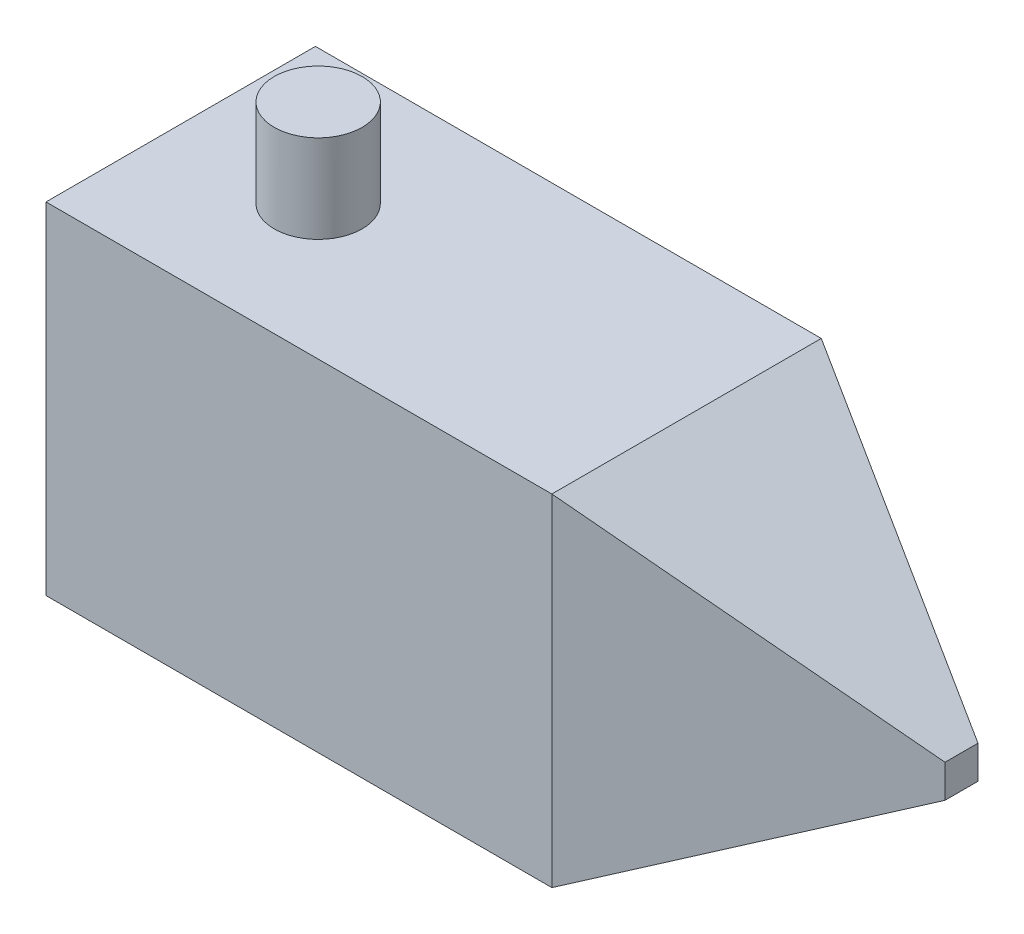
ISO-10303-21;
HEADER;
FILE_DESCRIPTION(('STEP AP214'),'2;1');
FILE_NAME('part.step','',(''),(''),'','','');
FILE_SCHEMA(('AUTOMOTIVE_DESIGN { 1 0 10303 214 1 1 1 1 }'));
ENDSEC;
DATA;
#1=APPLICATION_CONTEXT('core data for automotive mechanical design processes');
#2=APPLICATION_PROTOCOL_DEFINITION('international standard','automotive_design',2000,#1);
#3=PRODUCT_CONTEXT('',#1,'mechanical');
#4=PRODUCT('Part','Part','',(#3));
#5=PRODUCT_RELATED_PRODUCT_CATEGORY('part','',(#4));
#6=PRODUCT_DEFINITION_FORMATION('','',#4);
#7=PRODUCT_DEFINITION_CONTEXT('part definition',#1,'design');
#8=PRODUCT_DEFINITION('design','',#6,#7);
#9=PRODUCT_DEFINITION_SHAPE('','',#8);
#10=(LENGTH_UNIT() NAMED_UNIT(*) SI_UNIT(.MILLI.,.METRE.));
#11=(NAMED_UNIT(*) PLANE_ANGLE_UNIT() SI_UNIT($,.RADIAN.));
#12=(NAMED_UNIT(*) SI_UNIT($,.STERADIAN.) SOLID_ANGLE_UNIT());
#13=UNCERTAINTY_MEASURE_WITH_UNIT(LENGTH_MEASURE(1.E-05),#10,'distance_accuracy_value','');
#14=(GEOMETRIC_REPRESENTATION_CONTEXT(3) GLOBAL_UNCERTAINTY_ASSIGNED_CONTEXT((#13)) GLOBAL_UNIT_ASSIGNED_CONTEXT((#10,
#11,#12)) REPRESENTATION_CONTEXT('',''));
#15=CARTESIAN_POINT('',(0.,0.,0.));
#16=DIRECTION('',(0.,0.,1.));
#17=DIRECTION('',(1.,0.,0.));
#18=AXIS2_PLACEMENT_3D('',#15,#16,#17);
#19=CARTESIAN_POINT('',(0.,0.,0.));
#20=DIRECTION('',(0.,-1.,0.));
#21=DIRECTION('',(0.,0.,-1.));
#22=AXIS2_PLACEMENT_3D('',#19,#20,#21);
#23=PLANE('',#22);
#24=DIRECTION('',(0.,0.,1.));
#25=VECTOR('',#24,1.);
#26=CARTESIAN_POINT('',(23.,0.,0.));
#27=LINE('',#26,#25);
#28=CARTESIAN_POINT('',(23.,0.,12.25));
#29=VERTEX_POINT('',#28);
#30=CARTESIAN_POINT('',(23.,0.,-12.25));
#31=VERTEX_POINT('',#30);
#32=EDGE_CURVE('E373',#29,#31,#27,.F.);
#33=ORIENTED_EDGE('',*,*,#32,.F.);
#34=DIRECTION('',(1.,0.,0.));
#35=VECTOR('',#34,1.);
#36=CARTESIAN_POINT('',(-23.,0.,12.25));
#37=LINE('',#36,#35);
#38=CARTESIAN_POINT('',(-23.,0.,12.25));
#39=VERTEX_POINT('',#38);
#40=EDGE_CURVE('E382',#39,#29,#37,.T.);
#41=ORIENTED_EDGE('',*,*,#40,.F.);
#42=DIRECTION('',(0.,0.,1.));
#43=VECTOR('',#42,1.);
#44=CARTESIAN_POINT('',(-23.,0.,12.25));
#45=LINE('',#44,#43);
#46=CARTESIAN_POINT('',(-23.,0.,-12.25));
#47=VERTEX_POINT('',#46);
#48=EDGE_CURVE('E379',#47,#39,#45,.T.);
#49=ORIENTED_EDGE('',*,*,#48,.F.);
#50=DIRECTION('',(-1.,0.,0.));
#51=VECTOR('',#50,1.);
#52=CARTESIAN_POINT('',(-23.,0.,-12.25));
#53=LINE('',#52,#51);
#54=EDGE_CURVE('E383',#31,#47,#53,.T.);
#55=ORIENTED_EDGE('',*,*,#54,.F.);
#56=EDGE_LOOP('',(#33,#41,#49,#55));
#57=FACE_BOUND('',#56,.T.);
#58=DIRECTION('',(1.,0.,0.));
#59=VECTOR('',#58,1.);
#60=CARTESIAN_POINT('',(-21.,0.,10.25));
#61=LINE('',#60,#59);
#62=CARTESIAN_POINT('',(-21.,0.,10.25));
#63=VERTEX_POINT('',#62);
#64=CARTESIAN_POINT('',(21.,0.,10.25));
#65=VERTEX_POINT('',#64);
#66=EDGE_CURVE('E334',#63,#65,#61,.T.);
#67=ORIENTED_EDGE('',*,*,#66,.T.);
#68=DIRECTION('',(0.,0.,-1.));
#69=VECTOR('',#68,1.);
#70=CARTESIAN_POINT('',(21.,0.,-10.25));
#71=LINE('',#70,#69);
#72=CARTESIAN_POINT('',(21.,0.,-10.25));
#73=VERTEX_POINT('',#72);
#74=EDGE_CURVE('E344',#65,#73,#71,.T.);
#75=ORIENTED_EDGE('',*,*,#74,.T.);
#76=DIRECTION('',(-1.,0.,0.));
#77=VECTOR('',#76,1.);
#78=CARTESIAN_POINT('',(-21.,0.,-10.25));
#79=LINE('',#78,#77);
#80=CARTESIAN_POINT('',(-21.,0.,-10.25));
#81=VERTEX_POINT('',#80);
#82=EDGE_CURVE('E348',#73,#81,#79,.T.);
#83=ORIENTED_EDGE('',*,*,#82,.T.);
#84=DIRECTION('',(0.,0.,1.));
#85=VECTOR('',#84,1.);
#86=CARTESIAN_POINT('',(-21.,0.,-10.25));
#87=LINE('',#86,#85);
#88=EDGE_CURVE('E353',#81,#63,#87,.T.);
#89=ORIENTED_EDGE('',*,*,#88,.T.);
#90=EDGE_LOOP('',(#67,#75,#83,#89));
#91=FACE_BOUND('',#90,.T.);
#92=ADVANCED_FACE('F49',(#57,#91),#23,.T.);
#93=CARTESIAN_POINT('',(-23.,31.,-12.25));
#94=DIRECTION('',(0.,0.,1.));
#95=DIRECTION('',(1.,0.,0.));
#96=AXIS2_PLACEMENT_3D('',#93,#94,#95);
#97=PLANE('',#96);
#98=ORIENTED_EDGE('',*,*,#54,.T.);
#99=DIRECTION('',(0.,-1.,0.));
#100=VECTOR('',#99,1.);
#101=CARTESIAN_POINT('',(-23.,31.,-12.25));
#102=LINE('',#101,#100);
#103=CARTESIAN_POINT('',(-23.,31.,-12.25));
#104=VERTEX_POINT('',#103);
#105=EDGE_CURVE('E388',#104,#47,#102,.T.);
#106=ORIENTED_EDGE('',*,*,#105,.F.);
#107=DIRECTION('',(-1.,0.,0.));
#108=VECTOR('',#107,1.);
#109=CARTESIAN_POINT('',(-23.,31.,-12.25));
#110=LINE('',#109,#108);
#111=CARTESIAN_POINT('',(23.,31.,-12.25));
#112=VERTEX_POINT('',#111);
#113=EDGE_CURVE('E378',#112,#104,#110,.T.);
#114=ORIENTED_EDGE('',*,*,#113,.F.);
#115=DIRECTION('',(0.,1.,0.));
#116=VECTOR('',#115,1.);
#117=CARTESIAN_POINT('',(23.,31.,-12.25));
#118=LINE('',#117,#116);
#119=EDGE_CURVE('E393',#112,#31,#118,.F.);
#120=ORIENTED_EDGE('',*,*,#119,.T.);
#121=EDGE_LOOP('',(#98,#106,#114,#120));
#122=FACE_BOUND('',#121,.T.);
#123=ADVANCED_FACE('F51',(#122),#97,.F.);
#124=CARTESIAN_POINT('',(-23.,31.,12.25));
#125=DIRECTION('',(1.,0.,0.));
#126=DIRECTION('',(0.,0.,-1.));
#127=AXIS2_PLACEMENT_3D('',#124,#125,#126);
#128=PLANE('',#127);
#129=DIRECTION('',(0.,0.,1.));
#130=VECTOR('',#129,1.);
#131=CARTESIAN_POINT('',(-23.,22.,-4.50000000000001));
#132=LINE('',#131,#130);
#133=CARTESIAN_POINT('',(-23.,22.,-6.));
#134=VERTEX_POINT('',#133);
#135=CARTESIAN_POINT('',(-23.,22.,-4.50000000000001));
#136=VERTEX_POINT('',#135);
#137=EDGE_CURVE('E188',#134,#136,#132,.T.);
#138=ORIENTED_EDGE('',*,*,#137,.F.);
#139=DIRECTION('',(0.,-1.,0.));
#140=VECTOR('',#139,1.);
#141=CARTESIAN_POINT('',(-23.,22.,-6.00000000000001));
#142=LINE('',#141,#140);
#143=CARTESIAN_POINT('',(-23.,27.,-6.00000000000001));
#144=VERTEX_POINT('',#143);
#145=EDGE_CURVE('E65',#144,#134,#142,.T.);
#146=ORIENTED_EDGE('',*,*,#145,.F.);
#147=DIRECTION('',(0.,0.,-1.));
#148=VECTOR('',#147,1.);
#149=CARTESIAN_POINT('',(-23.,27.,-6.00000000000001));
#150=LINE('',#149,#148);
#151=CARTESIAN_POINT('',(-23.,27.,5.99999999999999));
#152=VERTEX_POINT('',#151);
#153=EDGE_CURVE('E216',#152,#144,#150,.T.);
#154=ORIENTED_EDGE('',*,*,#153,.F.);
#155=DIRECTION('',(0.,1.,0.));
#156=VECTOR('',#155,1.);
#157=CARTESIAN_POINT('',(-23.,27.,5.99999999999999));
#158=LINE('',#157,#156);
#159=CARTESIAN_POINT('',(-23.,22.,6.));
#160=VERTEX_POINT('',#159);
#161=EDGE_CURVE('E212',#160,#152,#158,.T.);
#162=ORIENTED_EDGE('',*,*,#161,.F.);
#163=DIRECTION('',(0.,0.,1.));
#164=VECTOR('',#163,1.);
#165=CARTESIAN_POINT('',(-23.,22.,6.));
#166=LINE('',#165,#164);
#167=CARTESIAN_POINT('',(-23.,22.,4.5));
#168=VERTEX_POINT('',#167);
#169=EDGE_CURVE('E208',#168,#160,#166,.T.);
#170=ORIENTED_EDGE('',*,*,#169,.F.);
#171=DIRECTION('',(0.,1.,0.));
#172=VECTOR('',#171,1.);
#173=CARTESIAN_POINT('',(-23.,22.,4.5));
#174=LINE('',#173,#172);
#175=CARTESIAN_POINT('',(-23.,2.,4.5));
#176=VERTEX_POINT('',#175);
#177=EDGE_CURVE('E201',#176,#168,#174,.T.);
#178=ORIENTED_EDGE('',*,*,#177,.F.);
#179=DIRECTION('',(0.,0.,1.));
#180=VECTOR('',#179,1.);
#181=CARTESIAN_POINT('',(-23.,2.,4.5));
#182=LINE('',#181,#180);
#183=CARTESIAN_POINT('',(-23.,2.,-4.50000000000001));
#184=VERTEX_POINT('',#183);
#185=EDGE_CURVE('E197',#184,#176,#182,.T.);
#186=ORIENTED_EDGE('',*,*,#185,.F.);
#187=DIRECTION('',(0.,-1.,0.));
#188=VECTOR('',#187,1.);
#189=CARTESIAN_POINT('',(-23.,2.,-4.50000000000001));
#190=LINE('',#189,#188);
#191=EDGE_CURVE('E178',#136,#184,#190,.T.);
#192=ORIENTED_EDGE('',*,*,#191,.F.);
#193=EDGE_LOOP('',(#138,#146,#154,#162,#170,#178,#186,#192));
#194=FACE_BOUND('',#193,.T.);
#195=ORIENTED_EDGE('',*,*,#48,.T.);
#196=DIRECTION('',(0.,-1.,0.));
#197=VECTOR('',#196,1.);
#198=CARTESIAN_POINT('',(-23.,31.,12.25));
#199=LINE('',#198,#197);
#200=CARTESIAN_POINT('',(-23.,31.,12.25));
#201=VERTEX_POINT('',#200);
#202=EDGE_CURVE('E384',#201,#39,#199,.T.);
#203=ORIENTED_EDGE('',*,*,#202,.F.);
#204=DIRECTION('',(0.,0.,1.));
#205=VECTOR('',#204,1.);
#206=CARTESIAN_POINT('',(-23.,31.,12.25));
#207=LINE('',#206,#205);
#208=EDGE_CURVE('E374',#104,#201,#207,.T.);
#209=ORIENTED_EDGE('',*,*,#208,.F.);
#210=ORIENTED_EDGE('',*,*,#105,.T.);
#211=EDGE_LOOP('',(#195,#203,#209,#210));
#212=FACE_BOUND('',#211,.T.);
#213=ADVANCED_FACE('F193',(#194,#212),#128,.F.);
#214=CARTESIAN_POINT('',(-23.,31.,12.25));
#215=DIRECTION('',(0.,0.,-1.));
#216=DIRECTION('',(-1.,0.,0.));
#217=AXIS2_PLACEMENT_3D('',#214,#215,#216);
#218=PLANE('',#217);
#219=ORIENTED_EDGE('',*,*,#40,.T.);
#220=DIRECTION('',(0.,1.,0.));
#221=VECTOR('',#220,1.);
#222=CARTESIAN_POINT('',(23.,0.,12.25));
#223=LINE('',#222,#221);
#224=CARTESIAN_POINT('',(23.,31.,12.25));
#225=VERTEX_POINT('',#224);
#226=EDGE_CURVE('E389',#225,#29,#223,.F.);
#227=ORIENTED_EDGE('',*,*,#226,.F.);
#228=DIRECTION('',(1.,0.,0.));
#229=VECTOR('',#228,1.);
#230=CARTESIAN_POINT('',(-23.,31.,12.25));
#231=LINE('',#230,#229);
#232=EDGE_CURVE('E377',#201,#225,#231,.T.);
#233=ORIENTED_EDGE('',*,*,#232,.F.);
#234=ORIENTED_EDGE('',*,*,#202,.T.);
#235=EDGE_LOOP('',(#219,#227,#233,#234));
#236=FACE_BOUND('',#235,.T.);
#237=ADVANCED_FACE('F477',(#236),#218,.F.);
#238=CARTESIAN_POINT('',(0.,31.,0.));
#239=DIRECTION('',(0.,-1.,0.));
#240=DIRECTION('',(0.,0.,-1.));
#241=AXIS2_PLACEMENT_3D('',#238,#239,#240);
#242=PLANE('',#241);
#243=CARTESIAN_POINT('',(-10.5,31.,0.));
#244=DIRECTION('',(0.,-1.,0.));
#245=DIRECTION('',(0.,0.,-1.));
#246=AXIS2_PLACEMENT_3D('',#243,#244,#245);
#247=CIRCLE('',#246,4.);
#248=CARTESIAN_POINT('',(-10.5,31.,-4.));
#249=VERTEX_POINT('',#248);
#250=EDGE_CURVE('E12',#249,#249,#247,.F.);
#251=ORIENTED_EDGE('',*,*,#250,.F.);
#252=EDGE_LOOP('',(#251));
#253=FACE_BOUND('',#252,.T.);
#254=DIRECTION('',(0.,0.,-1.));
#255=VECTOR('',#254,1.);
#256=CARTESIAN_POINT('',(23.,31.,0.));
#257=LINE('',#256,#255);
#258=EDGE_CURVE('E398',#225,#112,#257,.T.);
#259=ORIENTED_EDGE('',*,*,#258,.T.);
#260=ORIENTED_EDGE('',*,*,#113,.T.);
#261=ORIENTED_EDGE('',*,*,#208,.T.);
#262=ORIENTED_EDGE('',*,*,#232,.T.);
#263=EDGE_LOOP('',(#259,#260,#261,#262));
#264=FACE_BOUND('',#263,.T.);
#265=ADVANCED_FACE('F473',(#253,#264),#242,.F.);
#266=CARTESIAN_POINT('',(21.,29.,-10.25));
#267=DIRECTION('',(-1.,0.,0.));
#268=DIRECTION('',(0.,0.,1.));
#269=AXIS2_PLACEMENT_3D('',#266,#267,#268);
#270=PLANE('',#269);
#271=ORIENTED_EDGE('',*,*,#74,.F.);
#272=DIRECTION('',(0.,-1.,0.));
#273=VECTOR('',#272,1.);
#274=CARTESIAN_POINT('',(21.,29.,10.25));
#275=LINE('',#274,#273);
#276=CARTESIAN_POINT('',(21.,29.,10.25));
#277=VERTEX_POINT('',#276);
#278=EDGE_CURVE('E343',#277,#65,#275,.T.);
#279=ORIENTED_EDGE('',*,*,#278,.F.);
#280=DIRECTION('',(0.,0.,-1.));
#281=VECTOR('',#280,1.);
#282=CARTESIAN_POINT('',(21.,29.,-10.25));
#283=LINE('',#282,#281);
#284=CARTESIAN_POINT('',(21.,29.,-10.25));
#285=VERTEX_POINT('',#284);
#286=EDGE_CURVE('E324',#277,#285,#283,.T.);
#287=ORIENTED_EDGE('',*,*,#286,.T.);
#288=DIRECTION('',(0.,-1.,0.));
#289=VECTOR('',#288,1.);
#290=CARTESIAN_POINT('',(21.,29.,-10.25));
#291=LINE('',#290,#289);
#292=EDGE_CURVE('E369',#285,#73,#291,.T.);
#293=ORIENTED_EDGE('',*,*,#292,.T.);
#294=EDGE_LOOP('',(#271,#279,#287,#293));
#295=FACE_BOUND('',#294,.T.);
#296=ADVANCED_FACE('F476',(#295),#270,.T.);
#297=CARTESIAN_POINT('',(-21.,29.,-10.25));
#298=DIRECTION('',(0.,0.,1.));
#299=DIRECTION('',(1.,0.,0.));
#300=AXIS2_PLACEMENT_3D('',#297,#298,#299);
#301=PLANE('',#300);
#302=ORIENTED_EDGE('',*,*,#82,.F.);
#303=ORIENTED_EDGE('',*,*,#292,.F.);
#304=DIRECTION('',(-1.,0.,0.));
#305=VECTOR('',#304,1.);
#306=CARTESIAN_POINT('',(-21.,29.,-10.25));
#307=LINE('',#306,#305);
#308=CARTESIAN_POINT('',(-21.,29.,-10.25));
#309=VERTEX_POINT('',#308);
#310=EDGE_CURVE('E333',#285,#309,#307,.T.);
#311=ORIENTED_EDGE('',*,*,#310,.T.);
#312=DIRECTION('',(0.,-1.,0.));
#313=VECTOR('',#312,1.);
#314=CARTESIAN_POINT('',(-21.,29.,-10.25));
#315=LINE('',#314,#313);
#316=EDGE_CURVE('E366',#309,#81,#315,.T.);
#317=ORIENTED_EDGE('',*,*,#316,.T.);
#318=EDGE_LOOP('',(#302,#303,#311,#317));
#319=FACE_BOUND('',#318,.T.);
#320=ADVANCED_FACE('F526',(#319),#301,.T.);
#321=CARTESIAN_POINT('',(-21.,29.,-10.25));
#322=DIRECTION('',(1.,0.,0.));
#323=DIRECTION('',(0.,0.,-1.));
#324=AXIS2_PLACEMENT_3D('',#321,#322,#323);
#325=PLANE('',#324);
#326=DIRECTION('',(0.,1.,0.));
#327=VECTOR('',#326,1.);
#328=CARTESIAN_POINT('',(-21.,29.,-6.00000000000001));
#329=LINE('',#328,#327);
#330=CARTESIAN_POINT('',(-21.,22.,-6.00000000000001));
#331=VERTEX_POINT('',#330);
#332=CARTESIAN_POINT('',(-21.,27.,-6.00000000000001));
#333=VERTEX_POINT('',#332);
#334=EDGE_CURVE('E58',#331,#333,#329,.T.);
#335=ORIENTED_EDGE('',*,*,#334,.F.);
#336=DIRECTION('',(0.,0.,-1.));
#337=VECTOR('',#336,1.);
#338=CARTESIAN_POINT('',(-21.,22.,-10.25));
#339=LINE('',#338,#337);
#340=CARTESIAN_POINT('',(-21.,22.,-4.50000000000001));
#341=VERTEX_POINT('',#340);
#342=EDGE_CURVE('E416',#341,#331,#339,.T.);
#343=ORIENTED_EDGE('',*,*,#342,.F.);
#344=DIRECTION('',(0.,1.,0.));
#345=VECTOR('',#344,1.);
#346=CARTESIAN_POINT('',(-21.,29.,-4.50000000000001));
#347=LINE('',#346,#345);
#348=CARTESIAN_POINT('',(-21.,2.,-4.50000000000001));
#349=VERTEX_POINT('',#348);
#350=EDGE_CURVE('E181',#349,#341,#347,.T.);
#351=ORIENTED_EDGE('',*,*,#350,.F.);
#352=DIRECTION('',(0.,0.,-1.));
#353=VECTOR('',#352,1.);
#354=CARTESIAN_POINT('',(-21.,1.99999999999999,-10.25));
#355=LINE('',#354,#353);
#356=CARTESIAN_POINT('',(-21.,2.,4.5));
#357=VERTEX_POINT('',#356);
#358=EDGE_CURVE('E421',#357,#349,#355,.T.);
#359=ORIENTED_EDGE('',*,*,#358,.F.);
#360=DIRECTION('',(0.,-1.,0.));
#361=VECTOR('',#360,1.);
#362=CARTESIAN_POINT('',(-21.,29.,4.5));
#363=LINE('',#362,#361);
#364=CARTESIAN_POINT('',(-21.,22.,4.5));
#365=VERTEX_POINT('',#364);
#366=EDGE_CURVE('E424',#365,#357,#363,.T.);
#367=ORIENTED_EDGE('',*,*,#366,.F.);
#368=DIRECTION('',(0.,0.,-1.));
#369=VECTOR('',#368,1.);
#370=CARTESIAN_POINT('',(-21.,22.,-10.25));
#371=LINE('',#370,#369);
#372=CARTESIAN_POINT('',(-21.,22.,6.));
#373=VERTEX_POINT('',#372);
#374=EDGE_CURVE('E427',#373,#365,#371,.T.);
#375=ORIENTED_EDGE('',*,*,#374,.F.);
#376=DIRECTION('',(0.,-1.,0.));
#377=VECTOR('',#376,1.);
#378=CARTESIAN_POINT('',(-21.,29.,5.99999999999999));
#379=LINE('',#378,#377);
#380=CARTESIAN_POINT('',(-21.,27.,5.99999999999999));
#381=VERTEX_POINT('',#380);
#382=EDGE_CURVE('E430',#381,#373,#379,.T.);
#383=ORIENTED_EDGE('',*,*,#382,.F.);
#384=DIRECTION('',(0.,0.,1.));
#385=VECTOR('',#384,1.);
#386=CARTESIAN_POINT('',(-21.,27.,-10.25));
#387=LINE('',#386,#385);
#388=EDGE_CURVE('E433',#333,#381,#387,.T.);
#389=ORIENTED_EDGE('',*,*,#388,.F.);
#390=EDGE_LOOP('',(#335,#343,#351,#359,#367,#375,#383,#389));
#391=FACE_BOUND('',#390,.T.);
#392=ORIENTED_EDGE('',*,*,#88,.F.);
#393=ORIENTED_EDGE('',*,*,#316,.F.);
#394=DIRECTION('',(0.,0.,1.));
#395=VECTOR('',#394,1.);
#396=CARTESIAN_POINT('',(-21.,29.,-10.25));
#397=LINE('',#396,#395);
#398=CARTESIAN_POINT('',(-21.,29.,10.25));
#399=VERTEX_POINT('',#398);
#400=EDGE_CURVE('E337',#309,#399,#397,.T.);
#401=ORIENTED_EDGE('',*,*,#400,.T.);
#402=DIRECTION('',(0.,-1.,0.));
#403=VECTOR('',#402,1.);
#404=CARTESIAN_POINT('',(-21.,29.,10.25));
#405=LINE('',#404,#403);
#406=EDGE_CURVE('E363',#399,#63,#405,.T.);
#407=ORIENTED_EDGE('',*,*,#406,.T.);
#408=EDGE_LOOP('',(#392,#393,#401,#407));
#409=FACE_BOUND('',#408,.T.);
#410=ADVANCED_FACE('F446',(#391,#409),#325,.T.);
#411=CARTESIAN_POINT('',(-21.,29.,10.25));
#412=DIRECTION('',(0.,0.,-1.));
#413=DIRECTION('',(-1.,0.,0.));
#414=AXIS2_PLACEMENT_3D('',#411,#412,#413);
#415=PLANE('',#414);
#416=ORIENTED_EDGE('',*,*,#66,.F.);
#417=ORIENTED_EDGE('',*,*,#406,.F.);
#418=DIRECTION('',(1.,0.,0.));
#419=VECTOR('',#418,1.);
#420=CARTESIAN_POINT('',(-21.,29.,10.25));
#421=LINE('',#420,#419);
#422=EDGE_CURVE('E340',#399,#277,#421,.T.);
#423=ORIENTED_EDGE('',*,*,#422,.T.);
#424=ORIENTED_EDGE('',*,*,#278,.T.);
#425=EDGE_LOOP('',(#416,#417,#423,#424));
#426=FACE_BOUND('',#425,.T.);
#427=ADVANCED_FACE('F519',(#426),#415,.T.);
#428=CARTESIAN_POINT('',(0.,29.,0.));
#429=DIRECTION('',(0.,1.,0.));
#430=DIRECTION('',(0.,0.,1.));
#431=AXIS2_PLACEMENT_3D('',#428,#429,#430);
#432=PLANE('',#431);
#433=ORIENTED_EDGE('',*,*,#286,.F.);
#434=ORIENTED_EDGE('',*,*,#422,.F.);
#435=ORIENTED_EDGE('',*,*,#400,.F.);
#436=ORIENTED_EDGE('',*,*,#310,.F.);
#437=EDGE_LOOP('',(#433,#434,#435,#436));
#438=FACE_BOUND('',#437,.T.);
#439=ADVANCED_FACE('F516',(#438),#432,.F.);
#440=CARTESIAN_POINT('',(48.,0.,0.));
#441=DIRECTION('',(-1.,0.,0.));
#442=DIRECTION('',(0.,0.,1.));
#443=AXIS2_PLACEMENT_3D('',#440,#441,#442);
#444=PLANE('',#443);
#445=DIRECTION('',(0.,1.,0.));
#446=VECTOR('',#445,1.);
#447=CARTESIAN_POINT('',(48.,14.,-1.5));
#448=LINE('',#447,#446);
#449=CARTESIAN_POINT('',(48.,14.,-1.5));
#450=VERTEX_POINT('',#449);
#451=CARTESIAN_POINT('',(48.,17.,-1.5));
#452=VERTEX_POINT('',#451);
#453=EDGE_CURVE('E223',#450,#452,#448,.T.);
#454=ORIENTED_EDGE('',*,*,#453,.T.);
#455=DIRECTION('',(0.,0.,1.));
#456=VECTOR('',#455,1.);
#457=CARTESIAN_POINT('',(48.,17.,1.5));
#458=LINE('',#457,#456);
#459=CARTESIAN_POINT('',(48.,17.,1.5));
#460=VERTEX_POINT('',#459);
#461=EDGE_CURVE('E310',#452,#460,#458,.T.);
#462=ORIENTED_EDGE('',*,*,#461,.T.);
#463=DIRECTION('',(0.,-1.,0.));
#464=VECTOR('',#463,1.);
#465=CARTESIAN_POINT('',(48.,14.,1.5));
#466=LINE('',#465,#464);
#467=CARTESIAN_POINT('',(48.,14.,1.5));
#468=VERTEX_POINT('',#467);
#469=EDGE_CURVE('E294',#460,#468,#466,.T.);
#470=ORIENTED_EDGE('',*,*,#469,.T.);
#471=DIRECTION('',(0.,0.,-1.));
#472=VECTOR('',#471,1.);
#473=CARTESIAN_POINT('',(48.,14.,1.5));
#474=LINE('',#473,#472);
#475=EDGE_CURVE('E245',#468,#450,#474,.T.);
#476=ORIENTED_EDGE('',*,*,#475,.T.);
#477=EDGE_LOOP('',(#454,#462,#470,#476));
#478=FACE_BOUND('',#477,.T.);
#479=ADVANCED_FACE('F264',(#478),#444,.F.);
#480=CARTESIAN_POINT('',(5.49086479902557,-9.80511571254567,0.));
#481=DIRECTION('',(0.488603368931843,-0.87250601594972,0.));
#482=DIRECTION('',(0.87250601594972,0.488603368931843,0.));
#483=AXIS2_PLACEMENT_3D('',#480,#481,#482);
#484=PLANE('',#483);
#485=DIRECTION('',(-0.816905135659786,-0.45746687596948,0.351269208333708));
#486=VECTOR('',#485,1.);
#487=CARTESIAN_POINT('',(48.,14.,1.5));
#488=LINE('',#487,#486);
#489=EDGE_CURVE('E251',#468,#29,#488,.T.);
#490=ORIENTED_EDGE('',*,*,#489,.T.);
#491=ORIENTED_EDGE('',*,*,#32,.T.);
#492=DIRECTION('',(-0.816905135659786,-0.45746687596948,-0.351269208333708));
#493=VECTOR('',#492,1.);
#494=CARTESIAN_POINT('',(48.,14.,-1.5));
#495=LINE('',#494,#493);
#496=EDGE_CURVE('E493',#450,#31,#495,.T.);
#497=ORIENTED_EDGE('',*,*,#496,.F.);
#498=ORIENTED_EDGE('',*,*,#475,.F.);
#499=EDGE_LOOP('',(#490,#491,#497,#498));
#500=FACE_BOUND('',#499,.T.);
#501=ADVANCED_FACE('F253',(#500),#484,.T.);
#502=CARTESIAN_POINT('',(8.03460207612457,0.,-18.6851211072664));
#503=DIRECTION('',(-0.395027750659415,0.,0.918669187580036));
#504=DIRECTION('',(0.918669187580036,0.,0.395027750659415));
#505=AXIS2_PLACEMENT_3D('',#502,#503,#504);
#506=PLANE('',#505);
#507=ORIENTED_EDGE('',*,*,#496,.T.);
#508=ORIENTED_EDGE('',*,*,#119,.F.);
#509=DIRECTION('',(-0.816905135659786,0.45746687596948,-0.351269208333708));
#510=VECTOR('',#509,1.);
#511=CARTESIAN_POINT('',(48.,17.,-1.5));
#512=LINE('',#511,#510);
#513=EDGE_CURVE('E349',#452,#112,#512,.T.);
#514=ORIENTED_EDGE('',*,*,#513,.F.);
#515=ORIENTED_EDGE('',*,*,#453,.F.);
#516=EDGE_LOOP('',(#507,#508,#514,#515));
#517=FACE_BOUND('',#516,.T.);
#518=ADVANCED_FACE('F263',(#517),#506,.F.);
#519=CARTESIAN_POINT('',(8.03460207612456,0.,18.6851211072664));
#520=DIRECTION('',(0.395027750659415,0.,0.918669187580036));
#521=DIRECTION('',(0.918669187580036,0.,-0.395027750659415));
#522=AXIS2_PLACEMENT_3D('',#519,#520,#521);
#523=PLANE('',#522);
#524=DIRECTION('',(-0.816905135659786,0.45746687596948,0.351269208333708));
#525=VECTOR('',#524,1.);
#526=CARTESIAN_POINT('',(48.,17.,1.5));
#527=LINE('',#526,#525);
#528=EDGE_CURVE('E488',#460,#225,#527,.T.);
#529=ORIENTED_EDGE('',*,*,#528,.T.);
#530=ORIENTED_EDGE('',*,*,#226,.T.);
#531=ORIENTED_EDGE('',*,*,#489,.F.);
#532=ORIENTED_EDGE('',*,*,#469,.F.);
#533=EDGE_LOOP('',(#529,#530,#531,#532));
#534=FACE_BOUND('',#533,.T.);
#535=ADVANCED_FACE('F270',(#534),#523,.T.);
#536=CARTESIAN_POINT('',(18.7064555420219,33.4043848964677,0.));
#537=DIRECTION('',(-0.488603368931843,-0.87250601594972,0.));
#538=DIRECTION('',(0.87250601594972,-0.488603368931843,0.));
#539=AXIS2_PLACEMENT_3D('',#536,#537,#538);
#540=PLANE('',#539);
#541=ORIENTED_EDGE('',*,*,#513,.T.);
#542=ORIENTED_EDGE('',*,*,#258,.F.);
#543=ORIENTED_EDGE('',*,*,#528,.F.);
#544=ORIENTED_EDGE('',*,*,#461,.F.);
#545=EDGE_LOOP('',(#541,#542,#543,#544));
#546=FACE_BOUND('',#545,.T.);
#547=ADVANCED_FACE('F487',(#546),#540,.F.);
#548=CARTESIAN_POINT('',(6.,22.,-6.00000000000001));
#549=DIRECTION('',(0.,0.,-1.));
#550=DIRECTION('',(-1.,0.,0.));
#551=AXIS2_PLACEMENT_3D('',#548,#549,#550);
#552=PLANE('',#551);
#553=ORIENTED_EDGE('',*,*,#334,.T.);
#554=DIRECTION('',(-1.,0.,0.));
#555=VECTOR('',#554,1.);
#556=CARTESIAN_POINT('',(6.,27.,-6.00000000000001));
#557=LINE('',#556,#555);
#558=EDGE_CURVE('E220',#333,#144,#557,.T.);
#559=ORIENTED_EDGE('',*,*,#558,.T.);
#560=ORIENTED_EDGE('',*,*,#145,.T.);
#561=DIRECTION('',(-1.,0.,0.));
#562=VECTOR('',#561,1.);
#563=CARTESIAN_POINT('',(6.,22.,-6.00000000000001));
#564=LINE('',#563,#562);
#565=EDGE_CURVE('E185',#331,#134,#564,.T.);
#566=ORIENTED_EDGE('',*,*,#565,.F.);
#567=EDGE_LOOP('',(#553,#559,#560,#566));
#568=FACE_BOUND('',#567,.T.);
#569=ADVANCED_FACE('F438',(#568),#552,.F.);
#570=CARTESIAN_POINT('',(6.,27.,-6.00000000000001));
#571=DIRECTION('',(0.,1.,0.));
#572=DIRECTION('',(0.,0.,1.));
#573=AXIS2_PLACEMENT_3D('',#570,#571,#572);
#574=PLANE('',#573);
#575=ORIENTED_EDGE('',*,*,#388,.T.);
#576=DIRECTION('',(-1.,0.,0.));
#577=VECTOR('',#576,1.);
#578=CARTESIAN_POINT('',(6.,27.,5.99999999999999));
#579=LINE('',#578,#577);
#580=EDGE_CURVE('E224',#381,#152,#579,.T.);
#581=ORIENTED_EDGE('',*,*,#580,.T.);
#582=ORIENTED_EDGE('',*,*,#153,.T.);
#583=ORIENTED_EDGE('',*,*,#558,.F.);
#584=EDGE_LOOP('',(#575,#581,#582,#583));
#585=FACE_BOUND('',#584,.T.);
#586=ADVANCED_FACE('F442',(#585),#574,.F.);
#587=CARTESIAN_POINT('',(6.,27.,5.99999999999999));
#588=DIRECTION('',(0.,0.,1.));
#589=DIRECTION('',(0.,-1.,0.));
#590=AXIS2_PLACEMENT_3D('',#587,#588,#589);
#591=PLANE('',#590);
#592=ORIENTED_EDGE('',*,*,#382,.T.);
#593=DIRECTION('',(-1.,0.,0.));
#594=VECTOR('',#593,1.);
#595=CARTESIAN_POINT('',(6.,22.,6.));
#596=LINE('',#595,#594);
#597=EDGE_CURVE('E227',#373,#160,#596,.T.);
#598=ORIENTED_EDGE('',*,*,#597,.T.);
#599=ORIENTED_EDGE('',*,*,#161,.T.);
#600=ORIENTED_EDGE('',*,*,#580,.F.);
#601=EDGE_LOOP('',(#592,#598,#599,#600));
#602=FACE_BOUND('',#601,.T.);
#603=ADVANCED_FACE('F452',(#602),#591,.F.);
#604=CARTESIAN_POINT('',(6.,22.,6.));
#605=DIRECTION('',(0.,-1.,0.));
#606=DIRECTION('',(0.,0.,-1.));
#607=AXIS2_PLACEMENT_3D('',#604,#605,#606);
#608=PLANE('',#607);
#609=ORIENTED_EDGE('',*,*,#374,.T.);
#610=DIRECTION('',(-1.,0.,0.));
#611=VECTOR('',#610,1.);
#612=CARTESIAN_POINT('',(6.,22.,4.5));
#613=LINE('',#612,#611);
#614=EDGE_CURVE('E230',#365,#168,#613,.T.);
#615=ORIENTED_EDGE('',*,*,#614,.T.);
#616=ORIENTED_EDGE('',*,*,#169,.T.);
#617=ORIENTED_EDGE('',*,*,#597,.F.);
#618=EDGE_LOOP('',(#609,#615,#616,#617));
#619=FACE_BOUND('',#618,.T.);
#620=ADVANCED_FACE('F454',(#619),#608,.F.);
#621=CARTESIAN_POINT('',(6.,22.,4.5));
#622=DIRECTION('',(0.,0.,1.));
#623=DIRECTION('',(0.,-1.,0.));
#624=AXIS2_PLACEMENT_3D('',#621,#622,#623);
#625=PLANE('',#624);
#626=ORIENTED_EDGE('',*,*,#366,.T.);
#627=DIRECTION('',(-1.,0.,0.));
#628=VECTOR('',#627,1.);
#629=CARTESIAN_POINT('',(6.,2.,4.5));
#630=LINE('',#629,#628);
#631=EDGE_CURVE('E233',#357,#176,#630,.T.);
#632=ORIENTED_EDGE('',*,*,#631,.T.);
#633=ORIENTED_EDGE('',*,*,#177,.T.);
#634=ORIENTED_EDGE('',*,*,#614,.F.);
#635=EDGE_LOOP('',(#626,#632,#633,#634));
#636=FACE_BOUND('',#635,.T.);
#637=ADVANCED_FACE('F609',(#636),#625,.F.);
#638=CARTESIAN_POINT('',(6.,2.,4.5));
#639=DIRECTION('',(0.,-1.,0.));
#640=DIRECTION('',(0.,0.,-1.));
#641=AXIS2_PLACEMENT_3D('',#638,#639,#640);
#642=PLANE('',#641);
#643=ORIENTED_EDGE('',*,*,#358,.T.);
#644=DIRECTION('',(-1.,0.,0.));
#645=VECTOR('',#644,1.);
#646=CARTESIAN_POINT('',(6.,2.,-4.50000000000001));
#647=LINE('',#646,#645);
#648=EDGE_CURVE('E184',#349,#184,#647,.T.);
#649=ORIENTED_EDGE('',*,*,#648,.T.);
#650=ORIENTED_EDGE('',*,*,#185,.T.);
#651=ORIENTED_EDGE('',*,*,#631,.F.);
#652=EDGE_LOOP('',(#643,#649,#650,#651));
#653=FACE_BOUND('',#652,.T.);
#654=ADVANCED_FACE('F616',(#653),#642,.F.);
#655=CARTESIAN_POINT('',(6.,2.,-4.50000000000001));
#656=DIRECTION('',(0.,0.,-1.));
#657=DIRECTION('',(-1.,0.,0.));
#658=AXIS2_PLACEMENT_3D('',#655,#656,#657);
#659=PLANE('',#658);
#660=ORIENTED_EDGE('',*,*,#350,.T.);
#661=DIRECTION('',(-1.,0.,0.));
#662=VECTOR('',#661,1.);
#663=CARTESIAN_POINT('',(6.,22.,-4.50000000000001));
#664=LINE('',#663,#662);
#665=EDGE_CURVE('E73',#341,#136,#664,.T.);
#666=ORIENTED_EDGE('',*,*,#665,.T.);
#667=ORIENTED_EDGE('',*,*,#191,.T.);
#668=ORIENTED_EDGE('',*,*,#648,.F.);
#669=EDGE_LOOP('',(#660,#666,#667,#668));
#670=FACE_BOUND('',#669,.T.);
#671=ADVANCED_FACE('F175',(#670),#659,.F.);
#672=CARTESIAN_POINT('',(6.,22.,-4.50000000000001));
#673=DIRECTION('',(0.,-1.,0.));
#674=DIRECTION('',(0.,0.,-1.));
#675=AXIS2_PLACEMENT_3D('',#672,#673,#674);
#676=PLANE('',#675);
#677=ORIENTED_EDGE('',*,*,#342,.T.);
#678=ORIENTED_EDGE('',*,*,#565,.T.);
#679=ORIENTED_EDGE('',*,*,#137,.T.);
#680=ORIENTED_EDGE('',*,*,#665,.F.);
#681=EDGE_LOOP('',(#677,#678,#679,#680));
#682=FACE_BOUND('',#681,.T.);
#683=ADVANCED_FACE('F189',(#682),#676,.F.);
#684=CARTESIAN_POINT('',(-10.5,39.,0.));
#685=DIRECTION('',(0.,-1.,0.));
#686=DIRECTION('',(0.,0.,-1.));
#687=AXIS2_PLACEMENT_3D('',#684,#685,#686);
#688=CYLINDRICAL_SURFACE('',#687,4.);
#689=CARTESIAN_POINT('',(-10.5,39.,0.));
#690=DIRECTION('',(0.,1.,0.));
#691=DIRECTION('',(0.,0.,1.));
#692=AXIS2_PLACEMENT_3D('',#689,#690,#691);
#693=CIRCLE('',#692,4.);
#694=CARTESIAN_POINT('',(-10.5,39.,4.));
#695=VERTEX_POINT('',#694);
#696=EDGE_CURVE('E459',#695,#695,#693,.T.);
#697=ORIENTED_EDGE('',*,*,#696,.F.);
#698=EDGE_LOOP('',(#697));
#699=FACE_BOUND('',#698,.T.);
#700=ORIENTED_EDGE('',*,*,#250,.T.);
#701=EDGE_LOOP('',(#700));
#702=FACE_BOUND('',#701,.T.);
#703=ADVANCED_FACE('F467',(#699,#702),#688,.T.);
#704=CARTESIAN_POINT('',(-10.5,39.,0.));
#705=DIRECTION('',(0.,1.,0.));
#706=DIRECTION('',(0.,0.,1.));
#707=AXIS2_PLACEMENT_3D('',#704,#705,#706);
#708=PLANE('',#707);
#709=ORIENTED_EDGE('',*,*,#696,.T.);
#710=EDGE_LOOP('',(#709));
#711=FACE_BOUND('',#710,.T.);
#712=ADVANCED_FACE('F465',(#711),#708,.T.);
#713=CLOSED_SHELL('',(#92,#123,#213,#237,#265,#296,#320,#410,#427,#439,#479,#501,#518,#535,#547,
#569,#586,#603,#620,#637,#654,#671,#683,#703,#712));
#714=MANIFOLD_SOLID_BREP('B2',#713);
#715=ADVANCED_BREP_SHAPE_REPRESENTATION('',(#18,#714),#14);
#716=SHAPE_DEFINITION_REPRESENTATION(#9,#715);
ENDSEC;
END-ISO-10303-21;
